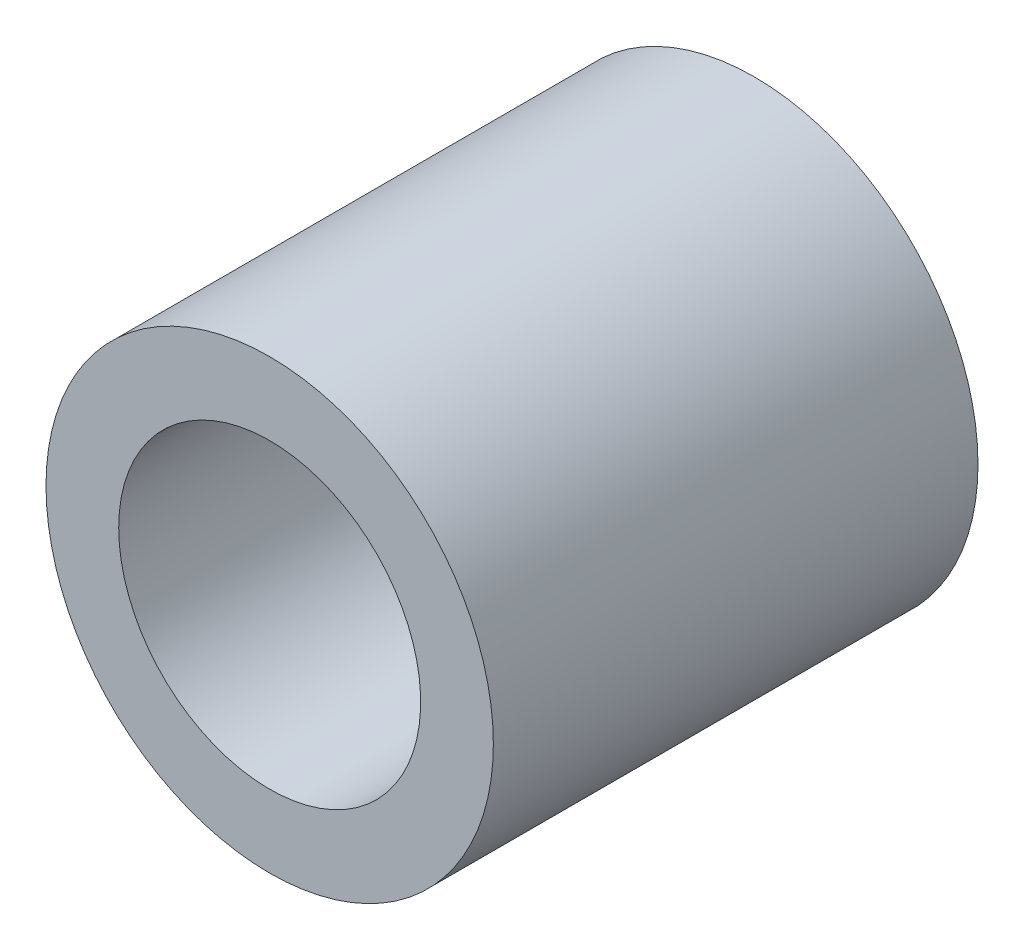
ISO-10303-21;
HEADER;
FILE_DESCRIPTION(('STEP AP214'),'2;1');
FILE_NAME('part.step','',(''),(''),'','','');
FILE_SCHEMA(('AUTOMOTIVE_DESIGN { 1 0 10303 214 1 1 1 1 }'));
ENDSEC;
DATA;
#1=APPLICATION_CONTEXT('core data for automotive mechanical design processes');
#2=APPLICATION_PROTOCOL_DEFINITION('international standard','automotive_design',2000,#1);
#3=PRODUCT_CONTEXT('',#1,'mechanical');
#4=PRODUCT('Part','Part','',(#3));
#5=PRODUCT_RELATED_PRODUCT_CATEGORY('part','',(#4));
#6=PRODUCT_DEFINITION_FORMATION('','',#4);
#7=PRODUCT_DEFINITION_CONTEXT('part definition',#1,'design');
#8=PRODUCT_DEFINITION('design','',#6,#7);
#9=PRODUCT_DEFINITION_SHAPE('','',#8);
#10=(LENGTH_UNIT() NAMED_UNIT(*) SI_UNIT(.MILLI.,.METRE.));
#11=(NAMED_UNIT(*) PLANE_ANGLE_UNIT() SI_UNIT($,.RADIAN.));
#12=(NAMED_UNIT(*) SI_UNIT($,.STERADIAN.) SOLID_ANGLE_UNIT());
#13=UNCERTAINTY_MEASURE_WITH_UNIT(LENGTH_MEASURE(1.E-05),#10,'distance_accuracy_value','');
#14=(GEOMETRIC_REPRESENTATION_CONTEXT(3) GLOBAL_UNCERTAINTY_ASSIGNED_CONTEXT((#13)) GLOBAL_UNIT_ASSIGNED_CONTEXT((#10,
#11,#12)) REPRESENTATION_CONTEXT('',''));
#15=CARTESIAN_POINT('',(0.,0.,0.));
#16=DIRECTION('',(0.,0.,1.));
#17=DIRECTION('',(1.,0.,0.));
#18=AXIS2_PLACEMENT_3D('',#15,#16,#17);
#19=CARTESIAN_POINT('',(0.,0.,13.));
#20=DIRECTION('',(0.,0.,1.));
#21=DIRECTION('',(1.,0.,0.));
#22=AXIS2_PLACEMENT_3D('',#19,#20,#21);
#23=PLANE('',#22);
#24=CARTESIAN_POINT('',(0.,0.,13.));
#25=DIRECTION('',(0.,0.,1.));
#26=DIRECTION('',(1.,0.,0.));
#27=AXIS2_PLACEMENT_3D('',#24,#25,#26);
#28=CIRCLE('',#27,6.);
#29=CARTESIAN_POINT('',(-6.,0.,13.));
#30=VERTEX_POINT('',#29);
#31=EDGE_CURVE('E10',#30,#30,#28,.T.);
#32=ORIENTED_EDGE('',*,*,#31,.T.);
#33=EDGE_LOOP('',(#32));
#34=FACE_BOUND('',#33,.T.);
#35=CARTESIAN_POINT('',(0.,0.,13.));
#36=DIRECTION('',(0.,0.,1.));
#37=DIRECTION('',(1.,0.,0.));
#38=AXIS2_PLACEMENT_3D('',#35,#36,#37);
#39=CIRCLE('',#38,4.05);
#40=CARTESIAN_POINT('',(-4.05,0.,13.));
#41=VERTEX_POINT('',#40);
#42=EDGE_CURVE('E42',#41,#41,#39,.T.);
#43=ORIENTED_EDGE('',*,*,#42,.F.);
#44=EDGE_LOOP('',(#43));
#45=FACE_BOUND('',#44,.T.);
#46=ADVANCED_FACE('F31',(#34,#45),#23,.T.);
#47=CARTESIAN_POINT('',(0.,0.,0.));
#48=DIRECTION('',(0.,0.,1.));
#49=DIRECTION('',(1.,0.,0.));
#50=AXIS2_PLACEMENT_3D('',#47,#48,#49);
#51=PLANE('',#50);
#52=CARTESIAN_POINT('',(0.,0.,0.));
#53=DIRECTION('',(0.,0.,1.));
#54=DIRECTION('',(1.,0.,0.));
#55=AXIS2_PLACEMENT_3D('',#52,#53,#54);
#56=CIRCLE('',#55,6.);
#57=CARTESIAN_POINT('',(-6.,0.,0.));
#58=VERTEX_POINT('',#57);
#59=EDGE_CURVE('E35',#58,#58,#56,.T.);
#60=ORIENTED_EDGE('',*,*,#59,.F.);
#61=EDGE_LOOP('',(#60));
#62=FACE_BOUND('',#61,.T.);
#63=CARTESIAN_POINT('',(0.,0.,0.));
#64=DIRECTION('',(0.,0.,1.));
#65=DIRECTION('',(1.,0.,0.));
#66=AXIS2_PLACEMENT_3D('',#63,#64,#65);
#67=CIRCLE('',#66,4.05);
#68=CARTESIAN_POINT('',(-4.05,0.,0.));
#69=VERTEX_POINT('',#68);
#70=EDGE_CURVE('E44',#69,#69,#67,.T.);
#71=ORIENTED_EDGE('',*,*,#70,.T.);
#72=EDGE_LOOP('',(#71));
#73=FACE_BOUND('',#72,.T.);
#74=ADVANCED_FACE('F54',(#62,#73),#51,.F.);
#75=CARTESIAN_POINT('',(0.,0.,13.));
#76=DIRECTION('',(0.,0.,-1.));
#77=DIRECTION('',(-1.,0.,0.));
#78=AXIS2_PLACEMENT_3D('',#75,#76,#77);
#79=CYLINDRICAL_SURFACE('',#78,6.);
#80=CARTESIAN_POINT('',(-6.,0.,13.));
#81=CARTESIAN_POINT('',(-6.,0.,12.8645833333333));
#82=CARTESIAN_POINT('',(-6.,0.,12.7291666666667));
#83=CARTESIAN_POINT('',(-6.,0.,12.4583333333333));
#84=CARTESIAN_POINT('',(-6.,0.,12.3229166666667));
#85=CARTESIAN_POINT('',(-6.,0.,12.0520833333333));
#86=CARTESIAN_POINT('',(-6.,0.,11.9166666666667));
#87=CARTESIAN_POINT('',(-6.,0.,11.6458333333333));
#88=CARTESIAN_POINT('',(-6.,0.,11.5104166666667));
#89=CARTESIAN_POINT('',(-6.,0.,11.2395833333333));
#90=CARTESIAN_POINT('',(-6.,0.,11.1041666666667));
#91=CARTESIAN_POINT('',(-6.,0.,10.8333333333333));
#92=CARTESIAN_POINT('',(-6.,0.,10.6979166666667));
#93=CARTESIAN_POINT('',(-6.,0.,10.4270833333333));
#94=CARTESIAN_POINT('',(-6.,0.,10.2916666666667));
#95=CARTESIAN_POINT('',(-6.,0.,10.0208333333333));
#96=CARTESIAN_POINT('',(-6.,0.,9.88541666666667));
#97=CARTESIAN_POINT('',(-6.,0.,9.61458333333333));
#98=CARTESIAN_POINT('',(-6.,0.,9.47916666666667));
#99=CARTESIAN_POINT('',(-6.,0.,9.20833333333333));
#100=CARTESIAN_POINT('',(-6.,0.,9.07291666666666));
#101=CARTESIAN_POINT('',(-6.,0.,8.80208333333333));
#102=CARTESIAN_POINT('',(-6.,0.,8.66666666666667));
#103=CARTESIAN_POINT('',(-6.,0.,8.39583333333333));
#104=CARTESIAN_POINT('',(-6.,0.,8.26041666666667));
#105=CARTESIAN_POINT('',(-6.,0.,7.98958333333333));
#106=CARTESIAN_POINT('',(-6.,0.,7.85416666666667));
#107=CARTESIAN_POINT('',(-6.,0.,7.58333333333333));
#108=CARTESIAN_POINT('',(-6.,0.,7.44791666666667));
#109=CARTESIAN_POINT('',(-6.,0.,7.17708333333333));
#110=CARTESIAN_POINT('',(-6.,0.,7.04166666666667));
#111=CARTESIAN_POINT('',(-6.,0.,6.77083333333333));
#112=CARTESIAN_POINT('',(-6.,0.,6.63541666666667));
#113=CARTESIAN_POINT('',(-6.,0.,6.36458333333333));
#114=CARTESIAN_POINT('',(-6.,0.,6.22916666666667));
#115=CARTESIAN_POINT('',(-6.,0.,5.95833333333333));
#116=CARTESIAN_POINT('',(-6.,0.,5.82291666666667));
#117=CARTESIAN_POINT('',(-6.,0.,5.55208333333333));
#118=CARTESIAN_POINT('',(-6.,0.,5.41666666666667));
#119=CARTESIAN_POINT('',(-6.,0.,5.14583333333333));
#120=CARTESIAN_POINT('',(-6.,0.,5.01041666666667));
#121=CARTESIAN_POINT('',(-6.,0.,4.73958333333333));
#122=CARTESIAN_POINT('',(-6.,0.,4.60416666666667));
#123=CARTESIAN_POINT('',(-6.,0.,4.33333333333333));
#124=CARTESIAN_POINT('',(-6.,0.,4.19791666666667));
#125=CARTESIAN_POINT('',(-6.,0.,3.92708333333333));
#126=CARTESIAN_POINT('',(-6.,0.,3.79166666666667));
#127=CARTESIAN_POINT('',(-6.,0.,3.52083333333333));
#128=CARTESIAN_POINT('',(-6.,0.,3.38541666666667));
#129=CARTESIAN_POINT('',(-6.,0.,3.11458333333333));
#130=CARTESIAN_POINT('',(-6.,0.,2.97916666666667));
#131=CARTESIAN_POINT('',(-6.,0.,2.70833333333333));
#132=CARTESIAN_POINT('',(-6.,0.,2.57291666666667));
#133=CARTESIAN_POINT('',(-6.,0.,2.30208333333333));
#134=CARTESIAN_POINT('',(-6.,0.,2.16666666666667));
#135=CARTESIAN_POINT('',(-6.,0.,1.89583333333333));
#136=CARTESIAN_POINT('',(-6.,0.,1.76041666666667));
#137=CARTESIAN_POINT('',(-6.,0.,1.48958333333333));
#138=CARTESIAN_POINT('',(-6.,0.,1.35416666666667));
#139=CARTESIAN_POINT('',(-6.,0.,1.08333333333333));
#140=CARTESIAN_POINT('',(-6.,0.,0.947916666666667));
#141=CARTESIAN_POINT('',(-6.,0.,0.677083333333334));
#142=CARTESIAN_POINT('',(-6.,0.,0.541666666666667));
#143=CARTESIAN_POINT('',(-6.,0.,0.270833333333334));
#144=CARTESIAN_POINT('',(-6.,0.,0.135416666666667));
#145=CARTESIAN_POINT('',(-6.,0.,0.));
#146=B_SPLINE_CURVE_WITH_KNOTS('',3,(#80,#81,#82,#83,#84,#85,#86,#87,#88,#89,#90,#91,#92,#93,
#94,#95,#96,#97,#98,#99,#100,#101,#102,#103,#104,#105,#106,#107,#108,#109,#110,#111,#112,#113,
#114,#115,#116,#117,#118,#119,#120,#121,#122,#123,#124,#125,#126,#127,#128,#129,#130,#131,#132,
#133,#134,#135,#136,#137,#138,#139,#140,#141,#142,#143,#144,#145),.UNSPECIFIED.,.F.,.F.,(4,2,2,
2,2,2,2,2,2,2,2,2,2,2,2,2,2,2,2,2,2,2,2,2,2,2,2,2,2,2,2,2,4),(0.,0.40625,0.812500000000001,
1.21875,1.625,2.03125,2.4375,2.84375,3.25,3.65625,4.0625,4.46875,4.875,5.28125,5.6875,6.09375,
6.5,6.90625,7.3125,7.71875,8.125,8.53125,8.9375,9.34375,9.75,10.15625,10.5625,10.96875,11.375,
11.78125,12.1875,12.59375,13.),.UNSPECIFIED.);
#147=EDGE_CURVE('BSEAM33',#30,#58,#146,.T.);
#148=ORIENTED_EDGE('',*,*,#31,.F.);
#149=ORIENTED_EDGE('',*,*,#59,.T.);
#150=ORIENTED_EDGE('',*,*,#147,.T.);
#151=ORIENTED_EDGE('',*,*,#147,.F.);
#152=EDGE_LOOP('',(#148,#150,#149,#151));
#153=FACE_BOUND('',#152,.T.);
#154=ADVANCED_FACE('F33',(#153),#79,.T.);
#155=CARTESIAN_POINT('',(0.,0.,13.));
#156=DIRECTION('',(0.,0.,-1.));
#157=DIRECTION('',(-1.,0.,0.));
#158=AXIS2_PLACEMENT_3D('',#155,#156,#157);
#159=CYLINDRICAL_SURFACE('',#158,4.05);
#160=CARTESIAN_POINT('',(-4.05,0.,13.));
#161=CARTESIAN_POINT('',(-4.05,0.,12.8645833333333));
#162=CARTESIAN_POINT('',(-4.05,0.,12.7291666666667));
#163=CARTESIAN_POINT('',(-4.05,0.,12.4583333333333));
#164=CARTESIAN_POINT('',(-4.05,0.,12.3229166666667));
#165=CARTESIAN_POINT('',(-4.05,0.,12.0520833333333));
#166=CARTESIAN_POINT('',(-4.05,0.,11.9166666666667));
#167=CARTESIAN_POINT('',(-4.05,0.,11.6458333333333));
#168=CARTESIAN_POINT('',(-4.05,0.,11.5104166666667));
#169=CARTESIAN_POINT('',(-4.05,0.,11.2395833333333));
#170=CARTESIAN_POINT('',(-4.05,0.,11.1041666666667));
#171=CARTESIAN_POINT('',(-4.05,0.,10.8333333333333));
#172=CARTESIAN_POINT('',(-4.05,0.,10.6979166666667));
#173=CARTESIAN_POINT('',(-4.05,0.,10.4270833333333));
#174=CARTESIAN_POINT('',(-4.05,0.,10.2916666666667));
#175=CARTESIAN_POINT('',(-4.05,0.,10.0208333333333));
#176=CARTESIAN_POINT('',(-4.05,0.,9.88541666666667));
#177=CARTESIAN_POINT('',(-4.05,0.,9.61458333333333));
#178=CARTESIAN_POINT('',(-4.05,0.,9.47916666666667));
#179=CARTESIAN_POINT('',(-4.05,0.,9.20833333333333));
#180=CARTESIAN_POINT('',(-4.05,0.,9.07291666666667));
#181=CARTESIAN_POINT('',(-4.05,0.,8.80208333333333));
#182=CARTESIAN_POINT('',(-4.05,0.,8.66666666666667));
#183=CARTESIAN_POINT('',(-4.05,0.,8.39583333333333));
#184=CARTESIAN_POINT('',(-4.05,0.,8.26041666666667));
#185=CARTESIAN_POINT('',(-4.05,0.,7.98958333333333));
#186=CARTESIAN_POINT('',(-4.05,0.,7.85416666666667));
#187=CARTESIAN_POINT('',(-4.05,0.,7.58333333333333));
#188=CARTESIAN_POINT('',(-4.05,0.,7.44791666666667));
#189=CARTESIAN_POINT('',(-4.05,0.,7.17708333333333));
#190=CARTESIAN_POINT('',(-4.05,0.,7.04166666666667));
#191=CARTESIAN_POINT('',(-4.05,0.,6.77083333333333));
#192=CARTESIAN_POINT('',(-4.05,0.,6.63541666666667));
#193=CARTESIAN_POINT('',(-4.05,0.,6.36458333333333));
#194=CARTESIAN_POINT('',(-4.05,0.,6.22916666666667));
#195=CARTESIAN_POINT('',(-4.05,0.,5.95833333333333));
#196=CARTESIAN_POINT('',(-4.05,0.,5.82291666666667));
#197=CARTESIAN_POINT('',(-4.05,0.,5.55208333333333));
#198=CARTESIAN_POINT('',(-4.05,0.,5.41666666666667));
#199=CARTESIAN_POINT('',(-4.05,0.,5.14583333333333));
#200=CARTESIAN_POINT('',(-4.05,0.,5.01041666666667));
#201=CARTESIAN_POINT('',(-4.05,0.,4.73958333333333));
#202=CARTESIAN_POINT('',(-4.05,0.,4.60416666666667));
#203=CARTESIAN_POINT('',(-4.05,0.,4.33333333333333));
#204=CARTESIAN_POINT('',(-4.05,0.,4.19791666666667));
#205=CARTESIAN_POINT('',(-4.05,0.,3.92708333333333));
#206=CARTESIAN_POINT('',(-4.05,0.,3.79166666666667));
#207=CARTESIAN_POINT('',(-4.05,0.,3.52083333333333));
#208=CARTESIAN_POINT('',(-4.05,0.,3.38541666666667));
#209=CARTESIAN_POINT('',(-4.05,0.,3.11458333333333));
#210=CARTESIAN_POINT('',(-4.05,0.,2.97916666666667));
#211=CARTESIAN_POINT('',(-4.05,0.,2.70833333333333));
#212=CARTESIAN_POINT('',(-4.05,0.,2.57291666666667));
#213=CARTESIAN_POINT('',(-4.05,0.,2.30208333333333));
#214=CARTESIAN_POINT('',(-4.05,0.,2.16666666666667));
#215=CARTESIAN_POINT('',(-4.05,0.,1.89583333333333));
#216=CARTESIAN_POINT('',(-4.05,0.,1.76041666666667));
#217=CARTESIAN_POINT('',(-4.05,0.,1.48958333333333));
#218=CARTESIAN_POINT('',(-4.05,0.,1.35416666666667));
#219=CARTESIAN_POINT('',(-4.05,0.,1.08333333333333));
#220=CARTESIAN_POINT('',(-4.05,0.,0.947916666666667));
#221=CARTESIAN_POINT('',(-4.05,0.,0.677083333333334));
#222=CARTESIAN_POINT('',(-4.05,0.,0.541666666666667));
#223=CARTESIAN_POINT('',(-4.05,0.,0.270833333333334));
#224=CARTESIAN_POINT('',(-4.05,0.,0.135416666666667));
#225=CARTESIAN_POINT('',(-4.05,0.,0.));
#226=B_SPLINE_CURVE_WITH_KNOTS('',3,(#160,#161,#162,#163,#164,#165,#166,#167,#168,#169,#170,
#171,#172,#173,#174,#175,#176,#177,#178,#179,#180,#181,#182,#183,#184,#185,#186,#187,#188,#189,
#190,#191,#192,#193,#194,#195,#196,#197,#198,#199,#200,#201,#202,#203,#204,#205,#206,#207,#208,
#209,#210,#211,#212,#213,#214,#215,#216,#217,#218,#219,#220,#221,#222,#223,#224,#225),
.UNSPECIFIED.,.F.,.F.,(4,2,2,2,2,2,2,2,2,2,2,2,2,2,2,2,2,2,2,2,2,2,2,2,2,2,2,2,2,2,2,2,4),(0.,
0.406249999999999,0.812499999999999,1.21875,1.625,2.03125,2.4375,2.84375,3.25,3.65625,4.0625,
4.46875,4.875,5.28125,5.6875,6.09375,6.5,6.90625,7.3125,7.71875,8.125,8.53125,8.9375,9.34375,
9.75,10.15625,10.5625,10.96875,11.375,11.78125,12.1875,12.59375,13.),.UNSPECIFIED.);
#227=EDGE_CURVE('BSEAM50',#41,#69,#226,.T.);
#228=ORIENTED_EDGE('',*,*,#42,.T.);
#229=ORIENTED_EDGE('',*,*,#70,.F.);
#230=ORIENTED_EDGE('',*,*,#227,.T.);
#231=ORIENTED_EDGE('',*,*,#227,.F.);
#232=EDGE_LOOP('',(#228,#230,#229,#231));
#233=FACE_BOUND('',#232,.T.);
#234=ADVANCED_FACE('F50',(#233),#159,.F.);
#235=CLOSED_SHELL('',(#46,#74,#154,#234));
#236=MANIFOLD_SOLID_BREP('B2',#235);
#237=ADVANCED_BREP_SHAPE_REPRESENTATION('',(#18,#236),#14);
#238=SHAPE_DEFINITION_REPRESENTATION(#9,#237);
ENDSEC;
END-ISO-10303-21;
